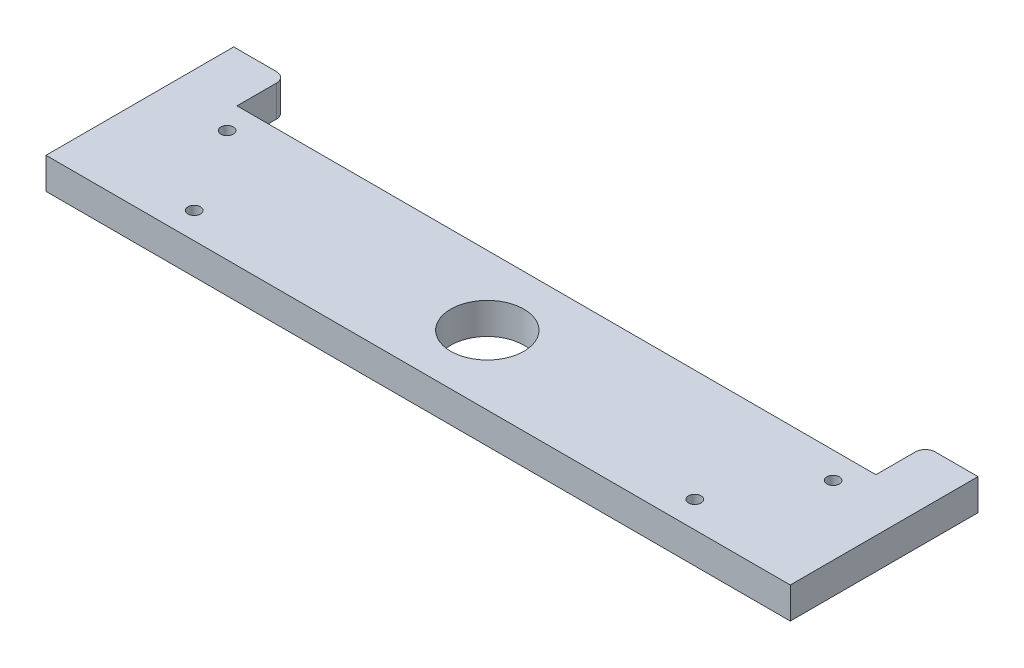
ISO-10303-21;
HEADER;
FILE_DESCRIPTION(('STEP AP214'),'2;1');
FILE_NAME('part.step','',(''),(''),'','','');
FILE_SCHEMA(('AUTOMOTIVE_DESIGN { 1 0 10303 214 1 1 1 1 }'));
ENDSEC;
DATA;
#1=APPLICATION_CONTEXT('core data for automotive mechanical design processes');
#2=APPLICATION_PROTOCOL_DEFINITION('international standard','automotive_design',2000,#1);
#3=PRODUCT_CONTEXT('',#1,'mechanical');
#4=PRODUCT('Part','Part','',(#3));
#5=PRODUCT_RELATED_PRODUCT_CATEGORY('part','',(#4));
#6=PRODUCT_DEFINITION_FORMATION('','',#4);
#7=PRODUCT_DEFINITION_CONTEXT('part definition',#1,'design');
#8=PRODUCT_DEFINITION('design','',#6,#7);
#9=PRODUCT_DEFINITION_SHAPE('','',#8);
#10=(LENGTH_UNIT() NAMED_UNIT(*) SI_UNIT(.MILLI.,.METRE.));
#11=(NAMED_UNIT(*) PLANE_ANGLE_UNIT() SI_UNIT($,.RADIAN.));
#12=(NAMED_UNIT(*) SI_UNIT($,.STERADIAN.) SOLID_ANGLE_UNIT());
#13=UNCERTAINTY_MEASURE_WITH_UNIT(LENGTH_MEASURE(1.E-05),#10,'distance_accuracy_value','');
#14=(GEOMETRIC_REPRESENTATION_CONTEXT(3) GLOBAL_UNCERTAINTY_ASSIGNED_CONTEXT((#13)) GLOBAL_UNIT_ASSIGNED_CONTEXT((#10,
#11,#12)) REPRESENTATION_CONTEXT('',''));
#15=CARTESIAN_POINT('',(0.,0.,0.));
#16=DIRECTION('',(0.,0.,1.));
#17=DIRECTION('',(1.,0.,0.));
#18=AXIS2_PLACEMENT_3D('',#15,#16,#17);
#19=CARTESIAN_POINT('',(189.,0.,-8.00000000000079));
#20=DIRECTION('',(0.,1.,0.));
#21=DIRECTION('',(0.,0.,1.));
#22=AXIS2_PLACEMENT_3D('',#19,#20,#21);
#23=CYLINDRICAL_SURFACE('',#22,1.9);
#24=CARTESIAN_POINT('',(189.,9.5,-8.00000000000079));
#25=DIRECTION('',(0.,1.,0.));
#26=DIRECTION('',(0.,0.,1.));
#27=AXIS2_PLACEMENT_3D('',#24,#25,#26);
#28=CIRCLE('',#27,1.9);
#29=CARTESIAN_POINT('',(189.,9.5,-6.10000000000078));
#30=VERTEX_POINT('',#29);
#31=EDGE_CURVE('E142',#30,#30,#28,.T.);
#32=ORIENTED_EDGE('',*,*,#31,.T.);
#33=EDGE_LOOP('',(#32));
#34=FACE_BOUND('',#33,.T.);
#35=CARTESIAN_POINT('',(189.,4.,-8.00000000000079));
#36=DIRECTION('',(0.,-1.,0.));
#37=DIRECTION('',(0.,0.,-1.));
#38=AXIS2_PLACEMENT_3D('',#35,#36,#37);
#39=CIRCLE('',#38,1.9);
#40=CARTESIAN_POINT('',(189.,4.,-9.90000000000079));
#41=VERTEX_POINT('',#40);
#42=EDGE_CURVE('E39',#41,#41,#39,.F.);
#43=ORIENTED_EDGE('',*,*,#42,.F.);
#44=EDGE_LOOP('',(#43));
#45=FACE_BOUND('',#44,.T.);
#46=ADVANCED_FACE('F35',(#34,#45),#23,.F.);
#47=CARTESIAN_POINT('',(205.,0.,-34.0000000000008));
#48=DIRECTION('',(0.,1.,0.));
#49=DIRECTION('',(0.,0.,1.));
#50=AXIS2_PLACEMENT_3D('',#47,#48,#49);
#51=CYLINDRICAL_SURFACE('',#50,1.9);
#52=CARTESIAN_POINT('',(205.,9.5,-34.0000000000008));
#53=DIRECTION('',(0.,1.,0.));
#54=DIRECTION('',(0.,0.,1.));
#55=AXIS2_PLACEMENT_3D('',#52,#53,#54);
#56=CIRCLE('',#55,1.9);
#57=CARTESIAN_POINT('',(205.,9.5,-32.1000000000008));
#58=VERTEX_POINT('',#57);
#59=EDGE_CURVE('E224',#58,#58,#56,.T.);
#60=ORIENTED_EDGE('',*,*,#59,.T.);
#61=EDGE_LOOP('',(#60));
#62=FACE_BOUND('',#61,.T.);
#63=CARTESIAN_POINT('',(205.,4.,-34.0000000000008));
#64=DIRECTION('',(0.,-1.,0.));
#65=DIRECTION('',(0.,0.,-1.));
#66=AXIS2_PLACEMENT_3D('',#63,#64,#65);
#67=CIRCLE('',#66,1.9);
#68=CARTESIAN_POINT('',(205.,4.,-35.9000000000008));
#69=VERTEX_POINT('',#68);
#70=EDGE_CURVE('E209',#69,#69,#67,.F.);
#71=ORIENTED_EDGE('',*,*,#70,.F.);
#72=EDGE_LOOP('',(#71));
#73=FACE_BOUND('',#72,.T.);
#74=ADVANCED_FACE('F282',(#62,#73),#51,.F.);
#75=CARTESIAN_POINT('',(21.,0.,-34.0000000000008));
#76=DIRECTION('',(0.,1.,0.));
#77=DIRECTION('',(0.,0.,1.));
#78=AXIS2_PLACEMENT_3D('',#75,#76,#77);
#79=CYLINDRICAL_SURFACE('',#78,1.90000000000001);
#80=CARTESIAN_POINT('',(21.,9.5,-34.0000000000008));
#81=DIRECTION('',(0.,1.,0.));
#82=DIRECTION('',(0.,0.,1.));
#83=AXIS2_PLACEMENT_3D('',#80,#81,#82);
#84=CIRCLE('',#83,1.90000000000001);
#85=CARTESIAN_POINT('',(21.,9.5,-32.1000000000008));
#86=VERTEX_POINT('',#85);
#87=EDGE_CURVE('E227',#86,#86,#84,.T.);
#88=ORIENTED_EDGE('',*,*,#87,.T.);
#89=EDGE_LOOP('',(#88));
#90=FACE_BOUND('',#89,.T.);
#91=CARTESIAN_POINT('',(21.,4.,-34.0000000000008));
#92=DIRECTION('',(0.,-1.,0.));
#93=DIRECTION('',(0.,0.,-1.));
#94=AXIS2_PLACEMENT_3D('',#91,#92,#93);
#95=CIRCLE('',#94,1.90000000000001);
#96=CARTESIAN_POINT('',(21.,4.,-35.9000000000008));
#97=VERTEX_POINT('',#96);
#98=EDGE_CURVE('E206',#97,#97,#95,.F.);
#99=ORIENTED_EDGE('',*,*,#98,.F.);
#100=EDGE_LOOP('',(#99));
#101=FACE_BOUND('',#100,.T.);
#102=ADVANCED_FACE('F288',(#90,#101),#79,.F.);
#103=CARTESIAN_POINT('',(37.,0.,-8.00000000000076));
#104=DIRECTION('',(0.,1.,0.));
#105=DIRECTION('',(0.,0.,1.));
#106=AXIS2_PLACEMENT_3D('',#103,#104,#105);
#107=CYLINDRICAL_SURFACE('',#106,1.90000000000001);
#108=CARTESIAN_POINT('',(37.,9.5,-8.00000000000076));
#109=DIRECTION('',(0.,1.,0.));
#110=DIRECTION('',(0.,0.,1.));
#111=AXIS2_PLACEMENT_3D('',#108,#109,#110);
#112=CIRCLE('',#111,1.90000000000001);
#113=CARTESIAN_POINT('',(37.,9.5,-6.10000000000074));
#114=VERTEX_POINT('',#113);
#115=EDGE_CURVE('E201',#114,#114,#112,.T.);
#116=ORIENTED_EDGE('',*,*,#115,.T.);
#117=EDGE_LOOP('',(#116));
#118=FACE_BOUND('',#117,.T.);
#119=CARTESIAN_POINT('',(37.,4.,-8.00000000000076));
#120=DIRECTION('',(0.,-1.,0.));
#121=DIRECTION('',(0.,0.,-1.));
#122=AXIS2_PLACEMENT_3D('',#119,#120,#121);
#123=CIRCLE('',#122,1.90000000000001);
#124=CARTESIAN_POINT('',(37.,4.,-9.90000000000077));
#125=VERTEX_POINT('',#124);
#126=EDGE_CURVE('E203',#125,#125,#123,.F.);
#127=ORIENTED_EDGE('',*,*,#126,.F.);
#128=EDGE_LOOP('',(#127));
#129=FACE_BOUND('',#128,.T.);
#130=ADVANCED_FACE('F232',(#118,#129),#107,.F.);
#131=CARTESIAN_POINT('',(0.,9.5,-42.));
#132=DIRECTION('',(0.,0.,1.));
#133=DIRECTION('',(1.,0.,0.));
#134=AXIS2_PLACEMENT_3D('',#131,#132,#133);
#135=PLANE('',#134);
#136=DIRECTION('',(0.,1.,0.));
#137=VECTOR('',#136,1.);
#138=CARTESIAN_POINT('',(210.,9.5,-42.));
#139=LINE('',#138,#137);
#140=CARTESIAN_POINT('',(210.,0.,-42.));
#141=VERTEX_POINT('',#140);
#142=CARTESIAN_POINT('',(210.,9.5,-42.));
#143=VERTEX_POINT('',#142);
#144=EDGE_CURVE('E139',#141,#143,#139,.T.);
#145=ORIENTED_EDGE('',*,*,#144,.F.);
#146=DIRECTION('',(-1.,0.,0.));
#147=VECTOR('',#146,1.);
#148=CARTESIAN_POINT('',(0.,0.,-42.));
#149=LINE('',#148,#147);
#150=CARTESIAN_POINT('',(16.,0.,-42.));
#151=VERTEX_POINT('',#150);
#152=EDGE_CURVE('E122',#141,#151,#149,.T.);
#153=ORIENTED_EDGE('',*,*,#152,.T.);
#154=DIRECTION('',(0.,-1.,0.));
#155=VECTOR('',#154,1.);
#156=CARTESIAN_POINT('',(16.,0.,-42.));
#157=LINE('',#156,#155);
#158=CARTESIAN_POINT('',(16.,9.5,-42.));
#159=VERTEX_POINT('',#158);
#160=EDGE_CURVE('E152',#159,#151,#157,.T.);
#161=ORIENTED_EDGE('',*,*,#160,.F.);
#162=DIRECTION('',(-1.,0.,0.));
#163=VECTOR('',#162,1.);
#164=CARTESIAN_POINT('',(0.,9.5,-42.));
#165=LINE('',#164,#163);
#166=EDGE_CURVE('E175',#143,#159,#165,.T.);
#167=ORIENTED_EDGE('',*,*,#166,.F.);
#168=EDGE_LOOP('',(#145,#153,#161,#167));
#169=FACE_BOUND('',#168,.T.);
#170=ADVANCED_FACE('F267',(#169),#135,.F.);
#171=CARTESIAN_POINT('',(0.,9.5,-42.));
#172=DIRECTION('',(1.,0.,0.));
#173=DIRECTION('',(0.,0.,-1.));
#174=AXIS2_PLACEMENT_3D('',#171,#172,#173);
#175=PLANE('',#174);
#176=DIRECTION('',(0.,0.,1.));
#177=VECTOR('',#176,1.);
#178=CARTESIAN_POINT('',(0.,0.,-42.));
#179=LINE('',#178,#177);
#180=CARTESIAN_POINT('',(0.,0.,-57.));
#181=VERTEX_POINT('',#180);
#182=CARTESIAN_POINT('',(0.,0.,0.));
#183=VERTEX_POINT('',#182);
#184=EDGE_CURVE('E167',#181,#183,#179,.T.);
#185=ORIENTED_EDGE('',*,*,#184,.T.);
#186=DIRECTION('',(0.,-1.,0.));
#187=VECTOR('',#186,1.);
#188=CARTESIAN_POINT('',(0.,9.5,0.));
#189=LINE('',#188,#187);
#190=CARTESIAN_POINT('',(0.,9.5,0.));
#191=VERTEX_POINT('',#190);
#192=EDGE_CURVE('E184',#191,#183,#189,.T.);
#193=ORIENTED_EDGE('',*,*,#192,.F.);
#194=DIRECTION('',(0.,0.,1.));
#195=VECTOR('',#194,1.);
#196=CARTESIAN_POINT('',(0.,9.5,-42.));
#197=LINE('',#196,#195);
#198=CARTESIAN_POINT('',(0.,9.5,-57.));
#199=VERTEX_POINT('',#198);
#200=EDGE_CURVE('E168',#199,#191,#197,.T.);
#201=ORIENTED_EDGE('',*,*,#200,.F.);
#202=DIRECTION('',(0.,1.,0.));
#203=VECTOR('',#202,1.);
#204=CARTESIAN_POINT('',(0.,0.,-57.));
#205=LINE('',#204,#203);
#206=EDGE_CURVE('E153',#181,#199,#205,.T.);
#207=ORIENTED_EDGE('',*,*,#206,.F.);
#208=EDGE_LOOP('',(#185,#193,#201,#207));
#209=FACE_BOUND('',#208,.T.);
#210=ADVANCED_FACE('F255',(#209),#175,.F.);
#211=CARTESIAN_POINT('',(0.,9.5,0.));
#212=DIRECTION('',(0.,0.,-1.));
#213=DIRECTION('',(-1.,0.,0.));
#214=AXIS2_PLACEMENT_3D('',#211,#212,#213);
#215=PLANE('',#214);
#216=DIRECTION('',(1.,0.,0.));
#217=VECTOR('',#216,1.);
#218=CARTESIAN_POINT('',(0.,0.,0.));
#219=LINE('',#218,#217);
#220=CARTESIAN_POINT('',(226.,0.,0.));
#221=VERTEX_POINT('',#220);
#222=EDGE_CURVE('E123',#183,#221,#219,.T.);
#223=ORIENTED_EDGE('',*,*,#222,.T.);
#224=DIRECTION('',(0.,-1.,0.));
#225=VECTOR('',#224,1.);
#226=CARTESIAN_POINT('',(226.,9.5,0.));
#227=LINE('',#226,#225);
#228=CARTESIAN_POINT('',(226.,9.5,0.));
#229=VERTEX_POINT('',#228);
#230=EDGE_CURVE('E121',#229,#221,#227,.T.);
#231=ORIENTED_EDGE('',*,*,#230,.F.);
#232=DIRECTION('',(1.,0.,0.));
#233=VECTOR('',#232,1.);
#234=CARTESIAN_POINT('',(0.,9.5,0.));
#235=LINE('',#234,#233);
#236=EDGE_CURVE('E171',#191,#229,#235,.T.);
#237=ORIENTED_EDGE('',*,*,#236,.F.);
#238=ORIENTED_EDGE('',*,*,#192,.T.);
#239=EDGE_LOOP('',(#223,#231,#237,#238));
#240=FACE_BOUND('',#239,.T.);
#241=ADVANCED_FACE('F251',(#240),#215,.F.);
#242=CARTESIAN_POINT('',(226.,9.5,-42.));
#243=DIRECTION('',(-1.,0.,0.));
#244=DIRECTION('',(0.,0.,1.));
#245=AXIS2_PLACEMENT_3D('',#242,#243,#244);
#246=PLANE('',#245);
#247=DIRECTION('',(0.,0.,-1.));
#248=VECTOR('',#247,1.);
#249=CARTESIAN_POINT('',(226.,0.,-42.));
#250=LINE('',#249,#248);
#251=CARTESIAN_POINT('',(226.,0.,-57.));
#252=VERTEX_POINT('',#251);
#253=EDGE_CURVE('E114',#221,#252,#250,.T.);
#254=ORIENTED_EDGE('',*,*,#253,.T.);
#255=DIRECTION('',(0.,-1.,0.));
#256=VECTOR('',#255,1.);
#257=CARTESIAN_POINT('',(226.,9.5,-57.));
#258=LINE('',#257,#256);
#259=CARTESIAN_POINT('',(226.,9.5,-57.));
#260=VERTEX_POINT('',#259);
#261=EDGE_CURVE('E119',#260,#252,#258,.T.);
#262=ORIENTED_EDGE('',*,*,#261,.F.);
#263=DIRECTION('',(0.,0.,-1.));
#264=VECTOR('',#263,1.);
#265=CARTESIAN_POINT('',(226.,9.5,-42.));
#266=LINE('',#265,#264);
#267=EDGE_CURVE('E173',#229,#260,#266,.T.);
#268=ORIENTED_EDGE('',*,*,#267,.F.);
#269=ORIENTED_EDGE('',*,*,#230,.T.);
#270=EDGE_LOOP('',(#254,#262,#268,#269));
#271=FACE_BOUND('',#270,.T.);
#272=ADVANCED_FACE('F116',(#271),#246,.F.);
#273=CARTESIAN_POINT('',(0.,9.5,0.));
#274=DIRECTION('',(0.,1.,0.));
#275=DIRECTION('',(0.,0.,1.));
#276=AXIS2_PLACEMENT_3D('',#273,#274,#275);
#277=PLANE('',#276);
#278=CARTESIAN_POINT('',(113.,9.5,-21.0000000000001));
#279=DIRECTION('',(0.,1.,0.));
#280=DIRECTION('',(0.,0.,1.));
#281=AXIS2_PLACEMENT_3D('',#278,#279,#280);
#282=CIRCLE('',#281,11.1);
#283=CARTESIAN_POINT('',(113.,9.5,-9.90000000000006));
#284=VERTEX_POINT('',#283);
#285=EDGE_CURVE('E202',#284,#284,#282,.T.);
#286=ORIENTED_EDGE('',*,*,#285,.F.);
#287=EDGE_LOOP('',(#286));
#288=FACE_BOUND('',#287,.T.);
#289=ORIENTED_EDGE('',*,*,#115,.F.);
#290=EDGE_LOOP('',(#289));
#291=FACE_BOUND('',#290,.T.);
#292=ORIENTED_EDGE('',*,*,#87,.F.);
#293=EDGE_LOOP('',(#292));
#294=FACE_BOUND('',#293,.T.);
#295=ORIENTED_EDGE('',*,*,#59,.F.);
#296=EDGE_LOOP('',(#295));
#297=FACE_BOUND('',#296,.T.);
#298=ORIENTED_EDGE('',*,*,#31,.F.);
#299=EDGE_LOOP('',(#298));
#300=FACE_BOUND('',#299,.T.);
#301=DIRECTION('',(1.,0.,0.));
#302=VECTOR('',#301,1.);
#303=CARTESIAN_POINT('',(226.,9.5,-57.));
#304=LINE('',#303,#302);
#305=CARTESIAN_POINT('',(213.,9.5,-57.));
#306=VERTEX_POINT('',#305);
#307=EDGE_CURVE('E134',#306,#260,#304,.T.);
#308=ORIENTED_EDGE('',*,*,#307,.F.);
#309=CARTESIAN_POINT('',(213.,9.5,-54.));
#310=DIRECTION('',(0.,1.,0.));
#311=DIRECTION('',(0.,0.,1.));
#312=AXIS2_PLACEMENT_3D('',#309,#310,#311);
#313=CIRCLE('',#312,3.);
#314=CARTESIAN_POINT('',(210.,9.5,-54.));
#315=VERTEX_POINT('',#314);
#316=EDGE_CURVE('E191',#306,#315,#313,.T.);
#317=ORIENTED_EDGE('',*,*,#316,.T.);
#318=DIRECTION('',(0.,0.,1.));
#319=VECTOR('',#318,1.);
#320=CARTESIAN_POINT('',(210.,9.5,-57.));
#321=LINE('',#320,#319);
#322=EDGE_CURVE('E147',#315,#143,#321,.T.);
#323=ORIENTED_EDGE('',*,*,#322,.T.);
#324=ORIENTED_EDGE('',*,*,#166,.T.);
#325=DIRECTION('',(0.,0.,1.));
#326=VECTOR('',#325,1.);
#327=CARTESIAN_POINT('',(16.,9.5,-57.));
#328=LINE('',#327,#326);
#329=CARTESIAN_POINT('',(16.,9.5,-54.));
#330=VERTEX_POINT('',#329);
#331=EDGE_CURVE('E165',#330,#159,#328,.T.);
#332=ORIENTED_EDGE('',*,*,#331,.F.);
#333=CARTESIAN_POINT('',(13.,9.5,-54.));
#334=DIRECTION('',(0.,1.,0.));
#335=DIRECTION('',(0.,0.,1.));
#336=AXIS2_PLACEMENT_3D('',#333,#334,#335);
#337=CIRCLE('',#336,3.);
#338=CARTESIAN_POINT('',(13.,9.5,-57.));
#339=VERTEX_POINT('',#338);
#340=EDGE_CURVE('E189',#330,#339,#337,.T.);
#341=ORIENTED_EDGE('',*,*,#340,.T.);
#342=DIRECTION('',(1.,0.,0.));
#343=VECTOR('',#342,1.);
#344=CARTESIAN_POINT('',(0.,9.5,-57.));
#345=LINE('',#344,#343);
#346=EDGE_CURVE('E156',#199,#339,#345,.T.);
#347=ORIENTED_EDGE('',*,*,#346,.F.);
#348=ORIENTED_EDGE('',*,*,#200,.T.);
#349=ORIENTED_EDGE('',*,*,#236,.T.);
#350=ORIENTED_EDGE('',*,*,#267,.T.);
#351=EDGE_LOOP('',(#308,#317,#323,#324,#332,#341,#347,#348,#349,#350));
#352=FACE_BOUND('',#351,.T.);
#353=ADVANCED_FACE('F235',(#288,#291,#294,#297,#300,#352),#277,.T.);
#354=CARTESIAN_POINT('',(0.,0.,0.));
#355=DIRECTION('',(0.,1.,0.));
#356=DIRECTION('',(0.,0.,1.));
#357=AXIS2_PLACEMENT_3D('',#354,#355,#356);
#358=PLANE('',#357);
#359=CARTESIAN_POINT('',(205.,0.,-34.0000000000008));
#360=DIRECTION('',(0.,-1.,0.));
#361=DIRECTION('',(0.,0.,-1.));
#362=AXIS2_PLACEMENT_3D('',#359,#360,#361);
#363=CIRCLE('',#362,3.99999999999999);
#364=CARTESIAN_POINT('',(205.,0.,-38.0000000000008));
#365=VERTEX_POINT('',#364);
#366=EDGE_CURVE('E492',#365,#365,#363,.T.);
#367=ORIENTED_EDGE('',*,*,#366,.F.);
#368=EDGE_LOOP('',(#367));
#369=FACE_BOUND('',#368,.T.);
#370=CARTESIAN_POINT('',(189.,0.,-8.00000000000079));
#371=DIRECTION('',(0.,-1.,0.));
#372=DIRECTION('',(0.,0.,-1.));
#373=AXIS2_PLACEMENT_3D('',#370,#371,#372);
#374=CIRCLE('',#373,3.99999999999999);
#375=CARTESIAN_POINT('',(189.,0.,-12.0000000000008));
#376=VERTEX_POINT('',#375);
#377=EDGE_CURVE('E485',#376,#376,#374,.T.);
#378=ORIENTED_EDGE('',*,*,#377,.F.);
#379=EDGE_LOOP('',(#378));
#380=FACE_BOUND('',#379,.T.);
#381=CARTESIAN_POINT('',(21.,0.,-34.0000000000008));
#382=DIRECTION('',(0.,-1.,0.));
#383=DIRECTION('',(0.,0.,-1.));
#384=AXIS2_PLACEMENT_3D('',#381,#382,#383);
#385=CIRCLE('',#384,4.);
#386=CARTESIAN_POINT('',(21.,0.,-38.0000000000008));
#387=VERTEX_POINT('',#386);
#388=EDGE_CURVE('E489',#387,#387,#385,.T.);
#389=ORIENTED_EDGE('',*,*,#388,.F.);
#390=EDGE_LOOP('',(#389));
#391=FACE_BOUND('',#390,.T.);
#392=CARTESIAN_POINT('',(37.,0.,-8.00000000000076));
#393=DIRECTION('',(0.,-1.,0.));
#394=DIRECTION('',(0.,0.,-1.));
#395=AXIS2_PLACEMENT_3D('',#392,#393,#394);
#396=CIRCLE('',#395,4.00000000000001);
#397=CARTESIAN_POINT('',(37.,0.,-12.0000000000008));
#398=VERTEX_POINT('',#397);
#399=EDGE_CURVE('E222',#398,#398,#396,.T.);
#400=ORIENTED_EDGE('',*,*,#399,.F.);
#401=EDGE_LOOP('',(#400));
#402=FACE_BOUND('',#401,.T.);
#403=CARTESIAN_POINT('',(113.,0.,-21.0000000000001));
#404=DIRECTION('',(0.,1.,0.));
#405=DIRECTION('',(0.,0.,1.));
#406=AXIS2_PLACEMENT_3D('',#403,#404,#405);
#407=CIRCLE('',#406,11.1);
#408=CARTESIAN_POINT('',(113.,0.,-9.90000000000006));
#409=VERTEX_POINT('',#408);
#410=EDGE_CURVE('E198',#409,#409,#407,.T.);
#411=ORIENTED_EDGE('',*,*,#410,.T.);
#412=EDGE_LOOP('',(#411));
#413=FACE_BOUND('',#412,.T.);
#414=DIRECTION('',(0.,0.,1.));
#415=VECTOR('',#414,1.);
#416=CARTESIAN_POINT('',(210.,0.,-57.));
#417=LINE('',#416,#415);
#418=CARTESIAN_POINT('',(210.,0.,-54.));
#419=VERTEX_POINT('',#418);
#420=EDGE_CURVE('E150',#419,#141,#417,.T.);
#421=ORIENTED_EDGE('',*,*,#420,.F.);
#422=CARTESIAN_POINT('',(213.,0.,-54.));
#423=DIRECTION('',(0.,1.,0.));
#424=DIRECTION('',(0.,0.,1.));
#425=AXIS2_PLACEMENT_3D('',#422,#423,#424);
#426=CIRCLE('',#425,3.);
#427=CARTESIAN_POINT('',(213.,0.,-57.));
#428=VERTEX_POINT('',#427);
#429=EDGE_CURVE('E130',#419,#428,#426,.F.);
#430=ORIENTED_EDGE('',*,*,#429,.T.);
#431=DIRECTION('',(-1.,0.,0.));
#432=VECTOR('',#431,1.);
#433=CARTESIAN_POINT('',(226.,0.,-57.));
#434=LINE('',#433,#432);
#435=EDGE_CURVE('E126',#252,#428,#434,.T.);
#436=ORIENTED_EDGE('',*,*,#435,.F.);
#437=ORIENTED_EDGE('',*,*,#253,.F.);
#438=ORIENTED_EDGE('',*,*,#222,.F.);
#439=ORIENTED_EDGE('',*,*,#184,.F.);
#440=DIRECTION('',(-1.,0.,0.));
#441=VECTOR('',#440,1.);
#442=CARTESIAN_POINT('',(0.,0.,-57.));
#443=LINE('',#442,#441);
#444=CARTESIAN_POINT('',(13.,0.,-57.));
#445=VERTEX_POINT('',#444);
#446=EDGE_CURVE('E159',#445,#181,#443,.T.);
#447=ORIENTED_EDGE('',*,*,#446,.F.);
#448=CARTESIAN_POINT('',(13.,0.,-54.));
#449=DIRECTION('',(0.,1.,0.));
#450=DIRECTION('',(0.,0.,1.));
#451=AXIS2_PLACEMENT_3D('',#448,#449,#450);
#452=CIRCLE('',#451,3.);
#453=CARTESIAN_POINT('',(16.,0.,-54.));
#454=VERTEX_POINT('',#453);
#455=EDGE_CURVE('E52',#445,#454,#452,.F.);
#456=ORIENTED_EDGE('',*,*,#455,.T.);
#457=DIRECTION('',(0.,0.,1.));
#458=VECTOR('',#457,1.);
#459=CARTESIAN_POINT('',(16.,0.,-57.));
#460=LINE('',#459,#458);
#461=EDGE_CURVE('E161',#454,#151,#460,.T.);
#462=ORIENTED_EDGE('',*,*,#461,.T.);
#463=ORIENTED_EDGE('',*,*,#152,.F.);
#464=EDGE_LOOP('',(#421,#430,#436,#437,#438,#439,#447,#456,#462,#463));
#465=FACE_BOUND('',#464,.T.);
#466=ADVANCED_FACE('F128',(#369,#380,#391,#402,#413,#465),#358,.F.);
#467=CARTESIAN_POINT('',(16.,0.,-57.));
#468=DIRECTION('',(-1.,0.,0.));
#469=DIRECTION('',(0.,0.,1.));
#470=AXIS2_PLACEMENT_3D('',#467,#468,#469);
#471=PLANE('',#470);
#472=ORIENTED_EDGE('',*,*,#461,.F.);
#473=DIRECTION('',(0.,-1.,0.));
#474=VECTOR('',#473,1.);
#475=CARTESIAN_POINT('',(16.,9.5,-54.));
#476=LINE('',#475,#474);
#477=EDGE_CURVE('E11',#454,#330,#476,.F.);
#478=ORIENTED_EDGE('',*,*,#477,.T.);
#479=ORIENTED_EDGE('',*,*,#331,.T.);
#480=ORIENTED_EDGE('',*,*,#160,.T.);
#481=EDGE_LOOP('',(#472,#478,#479,#480));
#482=FACE_BOUND('',#481,.T.);
#483=ADVANCED_FACE('F263',(#482),#471,.F.);
#484=CARTESIAN_POINT('',(0.,0.,-57.));
#485=DIRECTION('',(0.,0.,-1.));
#486=DIRECTION('',(-1.,0.,0.));
#487=AXIS2_PLACEMENT_3D('',#484,#485,#486);
#488=PLANE('',#487);
#489=ORIENTED_EDGE('',*,*,#346,.T.);
#490=DIRECTION('',(0.,-1.,0.));
#491=VECTOR('',#490,1.);
#492=CARTESIAN_POINT('',(13.,0.,-57.));
#493=LINE('',#492,#491);
#494=EDGE_CURVE('E44',#339,#445,#493,.T.);
#495=ORIENTED_EDGE('',*,*,#494,.T.);
#496=ORIENTED_EDGE('',*,*,#446,.T.);
#497=ORIENTED_EDGE('',*,*,#206,.T.);
#498=EDGE_LOOP('',(#489,#495,#496,#497));
#499=FACE_BOUND('',#498,.T.);
#500=ADVANCED_FACE('F257',(#499),#488,.T.);
#501=CARTESIAN_POINT('',(210.,9.5,-57.));
#502=DIRECTION('',(1.,0.,0.));
#503=DIRECTION('',(0.,0.,-1.));
#504=AXIS2_PLACEMENT_3D('',#501,#502,#503);
#505=PLANE('',#504);
#506=ORIENTED_EDGE('',*,*,#322,.F.);
#507=DIRECTION('',(0.,1.,0.));
#508=VECTOR('',#507,1.);
#509=CARTESIAN_POINT('',(210.,0.,-54.));
#510=LINE('',#509,#508);
#511=EDGE_CURVE('E193',#315,#419,#510,.F.);
#512=ORIENTED_EDGE('',*,*,#511,.T.);
#513=ORIENTED_EDGE('',*,*,#420,.T.);
#514=ORIENTED_EDGE('',*,*,#144,.T.);
#515=EDGE_LOOP('',(#506,#512,#513,#514));
#516=FACE_BOUND('',#515,.T.);
#517=ADVANCED_FACE('F269',(#516),#505,.F.);
#518=CARTESIAN_POINT('',(0.,0.,-57.));
#519=DIRECTION('',(0.,0.,-1.));
#520=DIRECTION('',(-1.,0.,0.));
#521=AXIS2_PLACEMENT_3D('',#518,#519,#520);
#522=PLANE('',#521);
#523=ORIENTED_EDGE('',*,*,#435,.T.);
#524=DIRECTION('',(0.,1.,0.));
#525=VECTOR('',#524,1.);
#526=CARTESIAN_POINT('',(213.,9.5,-57.));
#527=LINE('',#526,#525);
#528=EDGE_CURVE('E187',#428,#306,#527,.T.);
#529=ORIENTED_EDGE('',*,*,#528,.T.);
#530=ORIENTED_EDGE('',*,*,#307,.T.);
#531=ORIENTED_EDGE('',*,*,#261,.T.);
#532=EDGE_LOOP('',(#523,#529,#530,#531));
#533=FACE_BOUND('',#532,.T.);
#534=ADVANCED_FACE('F136',(#533),#522,.T.);
#535=CARTESIAN_POINT('',(213.,0.,-54.));
#536=DIRECTION('',(0.,-1.,0.));
#537=DIRECTION('',(0.,0.,-1.));
#538=AXIS2_PLACEMENT_3D('',#535,#536,#537);
#539=CYLINDRICAL_SURFACE('',#538,3.);
#540=ORIENTED_EDGE('',*,*,#429,.F.);
#541=ORIENTED_EDGE('',*,*,#511,.F.);
#542=ORIENTED_EDGE('',*,*,#316,.F.);
#543=ORIENTED_EDGE('',*,*,#528,.F.);
#544=EDGE_LOOP('',(#540,#541,#542,#543));
#545=FACE_BOUND('',#544,.T.);
#546=ADVANCED_FACE('F272',(#545),#539,.T.);
#547=CARTESIAN_POINT('',(13.,0.,-54.));
#548=DIRECTION('',(0.,1.,0.));
#549=DIRECTION('',(0.,0.,1.));
#550=AXIS2_PLACEMENT_3D('',#547,#548,#549);
#551=CYLINDRICAL_SURFACE('',#550,3.);
#552=ORIENTED_EDGE('',*,*,#340,.F.);
#553=ORIENTED_EDGE('',*,*,#477,.F.);
#554=ORIENTED_EDGE('',*,*,#455,.F.);
#555=ORIENTED_EDGE('',*,*,#494,.F.);
#556=EDGE_LOOP('',(#552,#553,#554,#555));
#557=FACE_BOUND('',#556,.T.);
#558=ADVANCED_FACE('F37',(#557),#551,.T.);
#559=CARTESIAN_POINT('',(113.,-0.5,-21.0000000000001));
#560=DIRECTION('',(0.,1.,0.));
#561=DIRECTION('',(0.,0.,1.));
#562=AXIS2_PLACEMENT_3D('',#559,#560,#561);
#563=CYLINDRICAL_SURFACE('',#562,11.1);
#564=ORIENTED_EDGE('',*,*,#285,.T.);
#565=EDGE_LOOP('',(#564));
#566=FACE_BOUND('',#565,.T.);
#567=ORIENTED_EDGE('',*,*,#410,.F.);
#568=EDGE_LOOP('',(#567));
#569=FACE_BOUND('',#568,.T.);
#570=ADVANCED_FACE('F278',(#566,#569),#563,.F.);
#571=CARTESIAN_POINT('',(37.,4.,-8.00000000000076));
#572=DIRECTION('',(0.,-1.,0.));
#573=DIRECTION('',(0.,0.,-1.));
#574=AXIS2_PLACEMENT_3D('',#571,#572,#573);
#575=PLANE('',#574);
#576=CARTESIAN_POINT('',(37.,4.,-8.00000000000076));
#577=DIRECTION('',(0.,-1.,0.));
#578=DIRECTION('',(0.,0.,-1.));
#579=AXIS2_PLACEMENT_3D('',#576,#577,#578);
#580=CIRCLE('',#579,4.00000000000001);
#581=CARTESIAN_POINT('',(37.,4.,-12.0000000000008));
#582=VERTEX_POINT('',#581);
#583=EDGE_CURVE('E207',#582,#582,#580,.T.);
#584=ORIENTED_EDGE('',*,*,#583,.T.);
#585=EDGE_LOOP('',(#584));
#586=FACE_BOUND('',#585,.T.);
#587=ORIENTED_EDGE('',*,*,#126,.T.);
#588=EDGE_LOOP('',(#587));
#589=FACE_BOUND('',#588,.T.);
#590=ADVANCED_FACE('F374',(#586,#589),#575,.T.);
#591=CARTESIAN_POINT('',(37.,4.,-8.00000000000076));
#592=DIRECTION('',(0.,-1.,0.));
#593=DIRECTION('',(0.,0.,-1.));
#594=AXIS2_PLACEMENT_3D('',#591,#592,#593);
#595=CYLINDRICAL_SURFACE('',#594,4.00000000000001);
#596=ORIENTED_EDGE('',*,*,#583,.F.);
#597=EDGE_LOOP('',(#596));
#598=FACE_BOUND('',#597,.T.);
#599=ORIENTED_EDGE('',*,*,#399,.T.);
#600=EDGE_LOOP('',(#599));
#601=FACE_BOUND('',#600,.T.);
#602=ADVANCED_FACE('F402',(#598,#601),#595,.F.);
#603=CARTESIAN_POINT('',(21.,4.,-34.0000000000008));
#604=DIRECTION('',(0.,-1.,0.));
#605=DIRECTION('',(0.,0.,-1.));
#606=AXIS2_PLACEMENT_3D('',#603,#604,#605);
#607=PLANE('',#606);
#608=CARTESIAN_POINT('',(21.,4.,-34.0000000000008));
#609=DIRECTION('',(0.,-1.,0.));
#610=DIRECTION('',(0.,0.,-1.));
#611=AXIS2_PLACEMENT_3D('',#608,#609,#610);
#612=CIRCLE('',#611,4.);
#613=CARTESIAN_POINT('',(21.,4.,-38.0000000000008));
#614=VERTEX_POINT('',#613);
#615=EDGE_CURVE('E500',#614,#614,#612,.T.);
#616=ORIENTED_EDGE('',*,*,#615,.T.);
#617=EDGE_LOOP('',(#616));
#618=FACE_BOUND('',#617,.T.);
#619=ORIENTED_EDGE('',*,*,#98,.T.);
#620=EDGE_LOOP('',(#619));
#621=FACE_BOUND('',#620,.T.);
#622=ADVANCED_FACE('F411',(#618,#621),#607,.T.);
#623=CARTESIAN_POINT('',(21.,4.,-34.0000000000008));
#624=DIRECTION('',(0.,-1.,0.));
#625=DIRECTION('',(0.,0.,-1.));
#626=AXIS2_PLACEMENT_3D('',#623,#624,#625);
#627=CYLINDRICAL_SURFACE('',#626,4.);
#628=ORIENTED_EDGE('',*,*,#615,.F.);
#629=EDGE_LOOP('',(#628));
#630=FACE_BOUND('',#629,.T.);
#631=ORIENTED_EDGE('',*,*,#388,.T.);
#632=EDGE_LOOP('',(#631));
#633=FACE_BOUND('',#632,.T.);
#634=ADVANCED_FACE('F420',(#630,#633),#627,.F.);
#635=CARTESIAN_POINT('',(205.,4.,-34.0000000000008));
#636=DIRECTION('',(0.,-1.,0.));
#637=DIRECTION('',(0.,0.,-1.));
#638=AXIS2_PLACEMENT_3D('',#635,#636,#637);
#639=PLANE('',#638);
#640=CARTESIAN_POINT('',(205.,4.,-34.0000000000008));
#641=DIRECTION('',(0.,-1.,0.));
#642=DIRECTION('',(0.,0.,-1.));
#643=AXIS2_PLACEMENT_3D('',#640,#641,#642);
#644=CIRCLE('',#643,3.99999999999999);
#645=CARTESIAN_POINT('',(205.,4.,-38.0000000000008));
#646=VERTEX_POINT('',#645);
#647=EDGE_CURVE('E487',#646,#646,#644,.T.);
#648=ORIENTED_EDGE('',*,*,#647,.T.);
#649=EDGE_LOOP('',(#648));
#650=FACE_BOUND('',#649,.T.);
#651=ORIENTED_EDGE('',*,*,#70,.T.);
#652=EDGE_LOOP('',(#651));
#653=FACE_BOUND('',#652,.T.);
#654=ADVANCED_FACE('F429',(#650,#653),#639,.T.);
#655=CARTESIAN_POINT('',(205.,4.,-34.0000000000008));
#656=DIRECTION('',(0.,-1.,0.));
#657=DIRECTION('',(0.,0.,-1.));
#658=AXIS2_PLACEMENT_3D('',#655,#656,#657);
#659=CYLINDRICAL_SURFACE('',#658,3.99999999999999);
#660=ORIENTED_EDGE('',*,*,#647,.F.);
#661=EDGE_LOOP('',(#660));
#662=FACE_BOUND('',#661,.T.);
#663=ORIENTED_EDGE('',*,*,#366,.T.);
#664=EDGE_LOOP('',(#663));
#665=FACE_BOUND('',#664,.T.);
#666=ADVANCED_FACE('F438',(#662,#665),#659,.F.);
#667=CARTESIAN_POINT('',(189.,4.,-8.00000000000079));
#668=DIRECTION('',(0.,-1.,0.));
#669=DIRECTION('',(0.,0.,-1.));
#670=AXIS2_PLACEMENT_3D('',#667,#668,#669);
#671=PLANE('',#670);
#672=CARTESIAN_POINT('',(189.,4.,-8.00000000000079));
#673=DIRECTION('',(0.,-1.,0.));
#674=DIRECTION('',(0.,0.,-1.));
#675=AXIS2_PLACEMENT_3D('',#672,#673,#674);
#676=CIRCLE('',#675,3.99999999999999);
#677=CARTESIAN_POINT('',(189.,4.,-12.0000000000008));
#678=VERTEX_POINT('',#677);
#679=EDGE_CURVE('E482',#678,#678,#676,.T.);
#680=ORIENTED_EDGE('',*,*,#679,.T.);
#681=EDGE_LOOP('',(#680));
#682=FACE_BOUND('',#681,.T.);
#683=ORIENTED_EDGE('',*,*,#42,.T.);
#684=EDGE_LOOP('',(#683));
#685=FACE_BOUND('',#684,.T.);
#686=ADVANCED_FACE('F447',(#682,#685),#671,.T.);
#687=CARTESIAN_POINT('',(189.,4.,-8.00000000000079));
#688=DIRECTION('',(0.,-1.,0.));
#689=DIRECTION('',(0.,0.,-1.));
#690=AXIS2_PLACEMENT_3D('',#687,#688,#689);
#691=CYLINDRICAL_SURFACE('',#690,3.99999999999999);
#692=ORIENTED_EDGE('',*,*,#679,.F.);
#693=EDGE_LOOP('',(#692));
#694=FACE_BOUND('',#693,.T.);
#695=ORIENTED_EDGE('',*,*,#377,.T.);
#696=EDGE_LOOP('',(#695));
#697=FACE_BOUND('',#696,.T.);
#698=ADVANCED_FACE('F456',(#694,#697),#691,.F.);
#699=CLOSED_SHELL('',(#46,#74,#102,#130,#170,#210,#241,#272,#353,#466,#483,#500,#517,#534,#546,
#558,#570,#590,#602,#622,#634,#654,#666,#686,#698));
#700=MANIFOLD_SOLID_BREP('B2',#699);
#701=ADVANCED_BREP_SHAPE_REPRESENTATION('',(#18,#700),#14);
#702=SHAPE_DEFINITION_REPRESENTATION(#9,#701);
ENDSEC;
END-ISO-10303-21;
